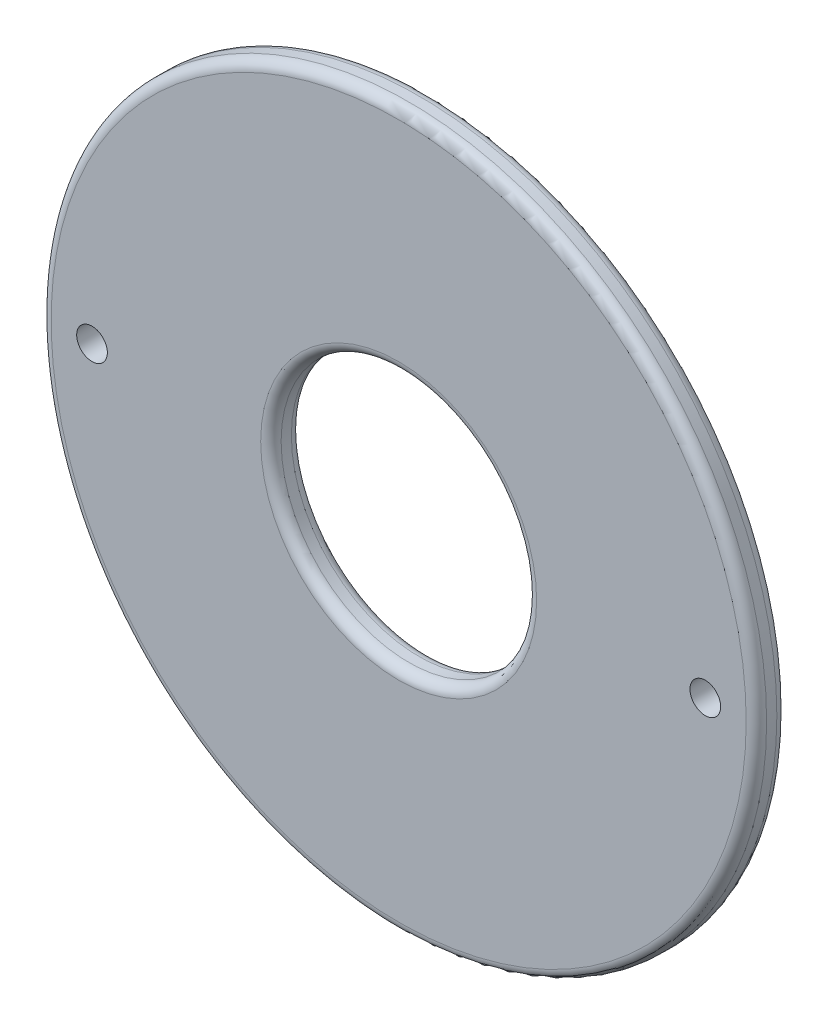
ISO-10303-21;
HEADER;
FILE_DESCRIPTION(('STEP AP214'),'2;1');
FILE_NAME('part.step','',(''),(''),'','','');
FILE_SCHEMA(('AUTOMOTIVE_DESIGN { 1 0 10303 214 1 1 1 1 }'));
ENDSEC;
DATA;
#1=APPLICATION_CONTEXT('core data for automotive mechanical design processes');
#2=APPLICATION_PROTOCOL_DEFINITION('international standard','automotive_design',2000,#1);
#3=PRODUCT_CONTEXT('',#1,'mechanical');
#4=PRODUCT('Part','Part','',(#3));
#5=PRODUCT_RELATED_PRODUCT_CATEGORY('part','',(#4));
#6=PRODUCT_DEFINITION_FORMATION('','',#4);
#7=PRODUCT_DEFINITION_CONTEXT('part definition',#1,'design');
#8=PRODUCT_DEFINITION('design','',#6,#7);
#9=PRODUCT_DEFINITION_SHAPE('','',#8);
#10=(LENGTH_UNIT() NAMED_UNIT(*) SI_UNIT(.MILLI.,.METRE.));
#11=(NAMED_UNIT(*) PLANE_ANGLE_UNIT() SI_UNIT($,.RADIAN.));
#12=(NAMED_UNIT(*) SI_UNIT($,.STERADIAN.) SOLID_ANGLE_UNIT());
#13=UNCERTAINTY_MEASURE_WITH_UNIT(LENGTH_MEASURE(1.E-05),#10,'distance_accuracy_value','');
#14=(GEOMETRIC_REPRESENTATION_CONTEXT(3) GLOBAL_UNCERTAINTY_ASSIGNED_CONTEXT((#13)) GLOBAL_UNIT_ASSIGNED_CONTEXT((#10,
#11,#12)) REPRESENTATION_CONTEXT('',''));
#15=CARTESIAN_POINT('',(0.,0.,0.));
#16=DIRECTION('',(0.,0.,1.));
#17=DIRECTION('',(1.,0.,0.));
#18=AXIS2_PLACEMENT_3D('',#15,#16,#17);
#19=CARTESIAN_POINT('',(0.,0.,3.));
#20=DIRECTION('',(0.,0.,1.));
#21=DIRECTION('',(1.,0.,0.));
#22=AXIS2_PLACEMENT_3D('',#19,#20,#21);
#23=PLANE('',#22);
#24=CARTESIAN_POINT('',(0.,0.,3.));
#25=DIRECTION('',(0.,0.,1.));
#26=DIRECTION('',(1.,0.,0.));
#27=AXIS2_PLACEMENT_3D('',#24,#25,#26);
#28=CIRCLE('',#27,13.5);
#29=CARTESIAN_POINT('',(13.5,0.,3.));
#30=VERTEX_POINT('',#29);
#31=EDGE_CURVE('E59',#30,#30,#28,.F.);
#32=ORIENTED_EDGE('',*,*,#31,.T.);
#33=EDGE_LOOP('',(#32));
#34=FACE_BOUND('',#33,.T.);
#35=CARTESIAN_POINT('',(0.,0.,3.));
#36=DIRECTION('',(0.,0.,1.));
#37=DIRECTION('',(1.,0.,0.));
#38=AXIS2_PLACEMENT_3D('',#35,#36,#37);
#39=CIRCLE('',#38,34.);
#40=CARTESIAN_POINT('',(34.,0.,3.));
#41=VERTEX_POINT('',#40);
#42=EDGE_CURVE('E62',#41,#41,#39,.T.);
#43=ORIENTED_EDGE('',*,*,#42,.T.);
#44=EDGE_LOOP('',(#43));
#45=FACE_BOUND('',#44,.T.);
#46=CARTESIAN_POINT('',(30.,0.,3.));
#47=DIRECTION('',(0.,0.,1.));
#48=DIRECTION('',(1.,0.,0.));
#49=AXIS2_PLACEMENT_3D('',#46,#47,#48);
#50=CIRCLE('',#49,1.50000000000001);
#51=CARTESIAN_POINT('',(31.5,0.,3.));
#52=VERTEX_POINT('',#51);
#53=EDGE_CURVE('E71',#52,#52,#50,.T.);
#54=ORIENTED_EDGE('',*,*,#53,.F.);
#55=EDGE_LOOP('',(#54));
#56=FACE_BOUND('',#55,.T.);
#57=CARTESIAN_POINT('',(-30.,0.,3.));
#58=DIRECTION('',(0.,0.,1.));
#59=DIRECTION('',(1.,0.,0.));
#60=AXIS2_PLACEMENT_3D('',#57,#58,#59);
#61=CIRCLE('',#60,1.5);
#62=CARTESIAN_POINT('',(-28.5,0.,3.));
#63=VERTEX_POINT('',#62);
#64=EDGE_CURVE('E75',#63,#63,#61,.T.);
#65=ORIENTED_EDGE('',*,*,#64,.F.);
#66=EDGE_LOOP('',(#65));
#67=FACE_BOUND('',#66,.T.);
#68=ADVANCED_FACE('F39',(#34,#45,#56,#67),#23,.T.);
#69=CARTESIAN_POINT('',(0.,0.,0.));
#70=DIRECTION('',(0.,0.,1.));
#71=DIRECTION('',(1.,0.,0.));
#72=AXIS2_PLACEMENT_3D('',#69,#70,#71);
#73=PLANE('',#72);
#74=CARTESIAN_POINT('',(0.,0.,0.));
#75=DIRECTION('',(0.,0.,1.));
#76=DIRECTION('',(1.,0.,0.));
#77=AXIS2_PLACEMENT_3D('',#74,#75,#76);
#78=CIRCLE('',#77,13.5);
#79=CARTESIAN_POINT('',(13.5,0.,0.));
#80=VERTEX_POINT('',#79);
#81=EDGE_CURVE('E50',#80,#80,#78,.T.);
#82=ORIENTED_EDGE('',*,*,#81,.T.);
#83=EDGE_LOOP('',(#82));
#84=FACE_BOUND('',#83,.T.);
#85=CARTESIAN_POINT('',(0.,0.,0.));
#86=DIRECTION('',(0.,0.,1.));
#87=DIRECTION('',(1.,0.,0.));
#88=AXIS2_PLACEMENT_3D('',#85,#86,#87);
#89=CIRCLE('',#88,34.);
#90=CARTESIAN_POINT('',(34.,0.,0.));
#91=VERTEX_POINT('',#90);
#92=EDGE_CURVE('E54',#91,#91,#89,.F.);
#93=ORIENTED_EDGE('',*,*,#92,.T.);
#94=EDGE_LOOP('',(#93));
#95=FACE_BOUND('',#94,.T.);
#96=CARTESIAN_POINT('',(30.,0.,0.));
#97=DIRECTION('',(0.,0.,1.));
#98=DIRECTION('',(1.,0.,0.));
#99=AXIS2_PLACEMENT_3D('',#96,#97,#98);
#100=CIRCLE('',#99,1.50000000000001);
#101=CARTESIAN_POINT('',(31.5,0.,0.));
#102=VERTEX_POINT('',#101);
#103=EDGE_CURVE('E72',#102,#102,#100,.T.);
#104=ORIENTED_EDGE('',*,*,#103,.T.);
#105=EDGE_LOOP('',(#104));
#106=FACE_BOUND('',#105,.T.);
#107=CARTESIAN_POINT('',(-30.,0.,0.));
#108=DIRECTION('',(0.,0.,1.));
#109=DIRECTION('',(1.,0.,0.));
#110=AXIS2_PLACEMENT_3D('',#107,#108,#109);
#111=CIRCLE('',#110,1.5);
#112=CARTESIAN_POINT('',(-28.5,0.,0.));
#113=VERTEX_POINT('',#112);
#114=EDGE_CURVE('E78',#113,#113,#111,.T.);
#115=ORIENTED_EDGE('',*,*,#114,.T.);
#116=EDGE_LOOP('',(#115));
#117=FACE_BOUND('',#116,.T.);
#118=ADVANCED_FACE('F88',(#84,#95,#106,#117),#73,.F.);
#119=CARTESIAN_POINT('',(0.,0.,3.));
#120=DIRECTION('',(0.,0.,-1.));
#121=DIRECTION('',(-1.,0.,0.));
#122=AXIS2_PLACEMENT_3D('',#119,#120,#121);
#123=CYLINDRICAL_SURFACE('',#122,35.);
#124=CARTESIAN_POINT('',(0.,0.,1.));
#125=DIRECTION('',(0.,0.,1.));
#126=DIRECTION('',(1.,0.,0.));
#127=AXIS2_PLACEMENT_3D('',#124,#125,#126);
#128=CIRCLE('',#127,35.);
#129=CARTESIAN_POINT('',(35.,0.,1.));
#130=VERTEX_POINT('',#129);
#131=EDGE_CURVE('E10',#130,#130,#128,.T.);
#132=ORIENTED_EDGE('',*,*,#131,.T.);
#133=EDGE_LOOP('',(#132));
#134=FACE_BOUND('',#133,.T.);
#135=CARTESIAN_POINT('',(0.,0.,2.));
#136=DIRECTION('',(0.,0.,1.));
#137=DIRECTION('',(1.,0.,0.));
#138=AXIS2_PLACEMENT_3D('',#135,#136,#137);
#139=CIRCLE('',#138,35.);
#140=CARTESIAN_POINT('',(35.,0.,2.));
#141=VERTEX_POINT('',#140);
#142=EDGE_CURVE('E46',#141,#141,#139,.F.);
#143=ORIENTED_EDGE('',*,*,#142,.T.);
#144=EDGE_LOOP('',(#143));
#145=FACE_BOUND('',#144,.T.);
#146=ADVANCED_FACE('F95',(#134,#145),#123,.T.);
#147=CARTESIAN_POINT('',(0.,0.,3.));
#148=DIRECTION('',(0.,0.,-1.));
#149=DIRECTION('',(-1.,0.,0.));
#150=AXIS2_PLACEMENT_3D('',#147,#148,#149);
#151=CYLINDRICAL_SURFACE('',#150,12.5);
#152=CARTESIAN_POINT('',(0.,0.,2.));
#153=DIRECTION('',(0.,0.,1.));
#154=DIRECTION('',(1.,0.,0.));
#155=AXIS2_PLACEMENT_3D('',#152,#153,#154);
#156=CIRCLE('',#155,12.5);
#157=CARTESIAN_POINT('',(12.5,0.,2.));
#158=VERTEX_POINT('',#157);
#159=EDGE_CURVE('E65',#158,#158,#156,.T.);
#160=ORIENTED_EDGE('',*,*,#159,.T.);
#161=EDGE_LOOP('',(#160));
#162=FACE_BOUND('',#161,.T.);
#163=CARTESIAN_POINT('',(0.,0.,1.));
#164=DIRECTION('',(0.,0.,1.));
#165=DIRECTION('',(1.,0.,0.));
#166=AXIS2_PLACEMENT_3D('',#163,#164,#165);
#167=CIRCLE('',#166,12.5);
#168=CARTESIAN_POINT('',(12.5,0.,1.));
#169=VERTEX_POINT('',#168);
#170=EDGE_CURVE('E68',#169,#169,#167,.F.);
#171=ORIENTED_EDGE('',*,*,#170,.T.);
#172=EDGE_LOOP('',(#171));
#173=FACE_BOUND('',#172,.T.);
#174=ADVANCED_FACE('F100',(#162,#173),#151,.F.);
#175=CARTESIAN_POINT('',(30.,0.,3.));
#176=DIRECTION('',(0.,0.,-1.));
#177=DIRECTION('',(-1.,0.,0.));
#178=AXIS2_PLACEMENT_3D('',#175,#176,#177);
#179=CYLINDRICAL_SURFACE('',#178,1.50000000000001);
#180=ORIENTED_EDGE('',*,*,#53,.T.);
#181=EDGE_LOOP('',(#180));
#182=FACE_BOUND('',#181,.T.);
#183=ORIENTED_EDGE('',*,*,#103,.F.);
#184=EDGE_LOOP('',(#183));
#185=FACE_BOUND('',#184,.T.);
#186=ADVANCED_FACE('F126',(#182,#185),#179,.F.);
#187=CARTESIAN_POINT('',(-30.,0.,3.));
#188=DIRECTION('',(0.,0.,-1.));
#189=DIRECTION('',(-1.,0.,0.));
#190=AXIS2_PLACEMENT_3D('',#187,#188,#189);
#191=CYLINDRICAL_SURFACE('',#190,1.5);
#192=ORIENTED_EDGE('',*,*,#64,.T.);
#193=EDGE_LOOP('',(#192));
#194=FACE_BOUND('',#193,.T.);
#195=ORIENTED_EDGE('',*,*,#114,.F.);
#196=EDGE_LOOP('',(#195));
#197=FACE_BOUND('',#196,.T.);
#198=ADVANCED_FACE('F84',(#194,#197),#191,.F.);
#199=CARTESIAN_POINT('',(0.,0.,2.));
#200=DIRECTION('',(0.,0.,1.));
#201=DIRECTION('',(1.,0.,0.));
#202=AXIS2_PLACEMENT_3D('',#199,#200,#201);
#203=TOROIDAL_SURFACE('',#202,13.5,1.);
#204=ORIENTED_EDGE('',*,*,#31,.F.);
#205=EDGE_LOOP('',(#204));
#206=FACE_BOUND('',#205,.T.);
#207=ORIENTED_EDGE('',*,*,#159,.F.);
#208=EDGE_LOOP('',(#207));
#209=FACE_BOUND('',#208,.T.);
#210=ADVANCED_FACE('F105',(#206,#209),#203,.T.);
#211=CARTESIAN_POINT('',(0.,0.,1.));
#212=DIRECTION('',(0.,0.,1.));
#213=DIRECTION('',(1.,0.,0.));
#214=AXIS2_PLACEMENT_3D('',#211,#212,#213);
#215=TOROIDAL_SURFACE('',#214,13.5,1.);
#216=ORIENTED_EDGE('',*,*,#170,.F.);
#217=EDGE_LOOP('',(#216));
#218=FACE_BOUND('',#217,.T.);
#219=ORIENTED_EDGE('',*,*,#81,.F.);
#220=EDGE_LOOP('',(#219));
#221=FACE_BOUND('',#220,.T.);
#222=ADVANCED_FACE('F108',(#218,#221),#215,.T.);
#223=CARTESIAN_POINT('',(0.,0.,1.));
#224=DIRECTION('',(0.,0.,1.));
#225=DIRECTION('',(1.,0.,0.));
#226=AXIS2_PLACEMENT_3D('',#223,#224,#225);
#227=TOROIDAL_SURFACE('',#226,34.,1.);
#228=ORIENTED_EDGE('',*,*,#92,.F.);
#229=EDGE_LOOP('',(#228));
#230=FACE_BOUND('',#229,.T.);
#231=ORIENTED_EDGE('',*,*,#131,.F.);
#232=EDGE_LOOP('',(#231));
#233=FACE_BOUND('',#232,.T.);
#234=ADVANCED_FACE('F111',(#230,#233),#227,.T.);
#235=CARTESIAN_POINT('',(0.,0.,2.));
#236=DIRECTION('',(0.,0.,1.));
#237=DIRECTION('',(1.,0.,0.));
#238=AXIS2_PLACEMENT_3D('',#235,#236,#237);
#239=TOROIDAL_SURFACE('',#238,34.,1.);
#240=ORIENTED_EDGE('',*,*,#142,.F.);
#241=EDGE_LOOP('',(#240));
#242=FACE_BOUND('',#241,.T.);
#243=ORIENTED_EDGE('',*,*,#42,.F.);
#244=EDGE_LOOP('',(#243));
#245=FACE_BOUND('',#244,.T.);
#246=ADVANCED_FACE('F41',(#242,#245),#239,.T.);
#247=CLOSED_SHELL('',(#68,#118,#146,#174,#186,#198,#210,#222,#234,#246));
#248=MANIFOLD_SOLID_BREP('B2',#247);
#249=ADVANCED_BREP_SHAPE_REPRESENTATION('',(#18,#248),#14);
#250=SHAPE_DEFINITION_REPRESENTATION(#9,#249);
ENDSEC;
END-ISO-10303-21;
